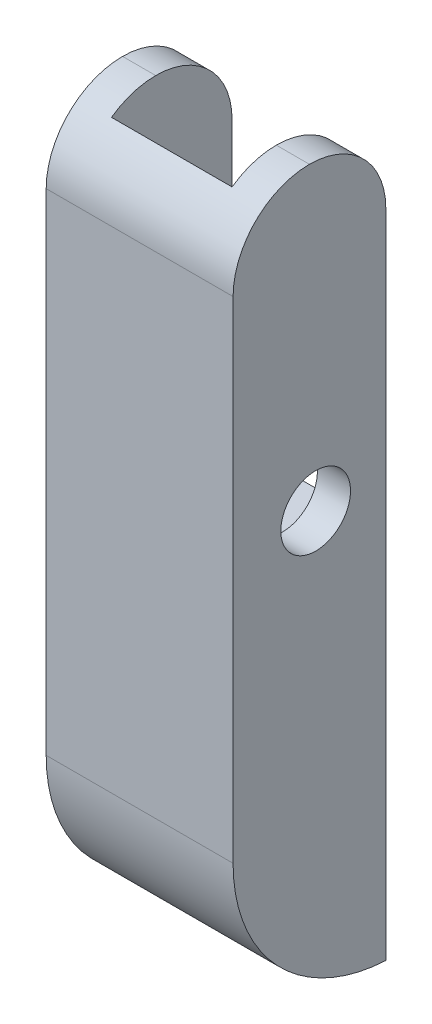
ISO-10303-21;
HEADER;
FILE_DESCRIPTION(('STEP AP214'),'2;1');
FILE_NAME('part.step','',(''),(''),'','','');
FILE_SCHEMA(('AUTOMOTIVE_DESIGN { 1 0 10303 214 1 1 1 1 }'));
ENDSEC;
DATA;
#1=APPLICATION_CONTEXT('core data for automotive mechanical design processes');
#2=APPLICATION_PROTOCOL_DEFINITION('international standard','automotive_design',2000,#1);
#3=PRODUCT_CONTEXT('',#1,'mechanical');
#4=PRODUCT('Part','Part','',(#3));
#5=PRODUCT_RELATED_PRODUCT_CATEGORY('part','',(#4));
#6=PRODUCT_DEFINITION_FORMATION('','',#4);
#7=PRODUCT_DEFINITION_CONTEXT('part definition',#1,'design');
#8=PRODUCT_DEFINITION('design','',#6,#7);
#9=PRODUCT_DEFINITION_SHAPE('','',#8);
#10=(LENGTH_UNIT() NAMED_UNIT(*) SI_UNIT(.MILLI.,.METRE.));
#11=(NAMED_UNIT(*) PLANE_ANGLE_UNIT() SI_UNIT($,.RADIAN.));
#12=(NAMED_UNIT(*) SI_UNIT($,.STERADIAN.) SOLID_ANGLE_UNIT());
#13=UNCERTAINTY_MEASURE_WITH_UNIT(LENGTH_MEASURE(1.E-05),#10,'distance_accuracy_value','');
#14=(GEOMETRIC_REPRESENTATION_CONTEXT(3) GLOBAL_UNCERTAINTY_ASSIGNED_CONTEXT((#13)) GLOBAL_UNIT_ASSIGNED_CONTEXT((#10,
#11,#12)) REPRESENTATION_CONTEXT('',''));
#15=CARTESIAN_POINT('',(0.,0.,0.));
#16=DIRECTION('',(0.,0.,1.));
#17=DIRECTION('',(1.,0.,0.));
#18=AXIS2_PLACEMENT_3D('',#15,#16,#17);
#19=CARTESIAN_POINT('',(0.,41.16324,4.826));
#20=DIRECTION('',(-1.,0.,0.));
#21=DIRECTION('',(0.,0.,1.));
#22=AXIS2_PLACEMENT_3D('',#19,#20,#21);
#23=CYLINDRICAL_SURFACE('',#22,4.826);
#24=CARTESIAN_POINT('',(9.7155,41.16324,4.826));
#25=DIRECTION('',(1.,0.,0.));
#26=DIRECTION('',(0.,1.,0.));
#27=AXIS2_PLACEMENT_3D('',#24,#25,#26);
#28=CIRCLE('',#27,4.826);
#29=CARTESIAN_POINT('',(9.7155,45.98924,4.826));
#30=VERTEX_POINT('',#29);
#31=CARTESIAN_POINT('',(9.7155,41.16324,0.));
#32=VERTEX_POINT('',#31);
#33=EDGE_CURVE('E179',#30,#32,#28,.F.);
#34=ORIENTED_EDGE('',*,*,#33,.F.);
#35=DIRECTION('',(1.,0.,0.));
#36=VECTOR('',#35,1.);
#37=CARTESIAN_POINT('',(0.,45.98924,4.826));
#38=LINE('',#37,#36);
#39=CARTESIAN_POINT('',(11.811,45.98924,4.826));
#40=VERTEX_POINT('',#39);
#41=EDGE_CURVE('E171',#40,#30,#38,.F.);
#42=ORIENTED_EDGE('',*,*,#41,.F.);
#43=CARTESIAN_POINT('',(11.811,41.16324,4.826));
#44=DIRECTION('',(-1.,0.,0.));
#45=DIRECTION('',(0.,0.,1.));
#46=AXIS2_PLACEMENT_3D('',#43,#44,#45);
#47=CIRCLE('',#46,4.826);
#48=CARTESIAN_POINT('',(11.811,41.16324,0.));
#49=VERTEX_POINT('',#48);
#50=EDGE_CURVE('E168',#49,#40,#47,.F.);
#51=ORIENTED_EDGE('',*,*,#50,.F.);
#52=DIRECTION('',(1.,0.,0.));
#53=VECTOR('',#52,1.);
#54=CARTESIAN_POINT('',(11.811,41.16324,0.));
#55=LINE('',#54,#53);
#56=EDGE_CURVE('E158',#32,#49,#55,.T.);
#57=ORIENTED_EDGE('',*,*,#56,.F.);
#58=EDGE_LOOP('',(#34,#42,#51,#57));
#59=FACE_BOUND('',#58,.T.);
#60=ADVANCED_FACE('F41',(#59),#23,.T.);
#61=CARTESIAN_POINT('',(11.811,0.,9.652));
#62=DIRECTION('',(-1.,0.,0.));
#63=DIRECTION('',(0.,0.,1.));
#64=AXIS2_PLACEMENT_3D('',#61,#62,#63);
#65=PLANE('',#64);
#66=CARTESIAN_POINT('',(11.811,26.82494,4.4323));
#67=DIRECTION('',(-1.,0.,0.));
#68=DIRECTION('',(0.,0.,1.));
#69=AXIS2_PLACEMENT_3D('',#66,#67,#68);
#70=CIRCLE('',#69,2.20345);
#71=CARTESIAN_POINT('',(11.811,26.82494,6.63575));
#72=VERTEX_POINT('',#71);
#73=EDGE_CURVE('E186',#72,#72,#70,.T.);
#74=ORIENTED_EDGE('',*,*,#73,.T.);
#75=EDGE_LOOP('',(#74));
#76=FACE_BOUND('',#75,.T.);
#77=DIRECTION('',(0.,1.,0.));
#78=VECTOR('',#77,1.);
#79=CARTESIAN_POINT('',(11.811,0.,9.652));
#80=LINE('',#79,#78);
#81=CARTESIAN_POINT('',(11.811,10.1472920525626,9.652));
#82=VERTEX_POINT('',#81);
#83=CARTESIAN_POINT('',(11.811,41.16324,9.652));
#84=VERTEX_POINT('',#83);
#85=EDGE_CURVE('E153',#82,#84,#80,.T.);
#86=ORIENTED_EDGE('',*,*,#85,.F.);
#87=CARTESIAN_POINT('',(11.811,10.1472920525626,-0.508000000000002));
#88=DIRECTION('',(-1.,0.,0.));
#89=DIRECTION('',(0.,0.,1.));
#90=AXIS2_PLACEMENT_3D('',#87,#88,#89);
#91=CIRCLE('',#90,10.16);
#92=CARTESIAN_POINT('',(11.811,0.,0.));
#93=VERTEX_POINT('',#92);
#94=EDGE_CURVE('E49',#82,#93,#91,.F.);
#95=ORIENTED_EDGE('',*,*,#94,.T.);
#96=DIRECTION('',(0.,1.,0.));
#97=VECTOR('',#96,1.);
#98=CARTESIAN_POINT('',(11.811,0.,0.));
#99=LINE('',#98,#97);
#100=EDGE_CURVE('E160',#93,#49,#99,.T.);
#101=ORIENTED_EDGE('',*,*,#100,.T.);
#102=ORIENTED_EDGE('',*,*,#50,.T.);
#103=CARTESIAN_POINT('',(11.811,41.16324,4.826));
#104=DIRECTION('',(-1.,0.,0.));
#105=DIRECTION('',(0.,0.,1.));
#106=AXIS2_PLACEMENT_3D('',#103,#104,#105);
#107=CIRCLE('',#106,4.826);
#108=EDGE_CURVE('E191',#40,#84,#107,.F.);
#109=ORIENTED_EDGE('',*,*,#108,.T.);
#110=EDGE_LOOP('',(#86,#95,#101,#102,#109));
#111=FACE_BOUND('',#110,.T.);
#112=ADVANCED_FACE('F203',(#76,#111),#65,.F.);
#113=CARTESIAN_POINT('',(0.,0.,9.652));
#114=DIRECTION('',(-1.,0.,0.));
#115=DIRECTION('',(0.,0.,1.));
#116=AXIS2_PLACEMENT_3D('',#113,#114,#115);
#117=PLANE('',#116);
#118=CARTESIAN_POINT('',(0.,26.82494,4.4323));
#119=DIRECTION('',(-1.,0.,0.));
#120=DIRECTION('',(0.,0.,1.));
#121=AXIS2_PLACEMENT_3D('',#118,#119,#120);
#122=CIRCLE('',#121,2.20345);
#123=CARTESIAN_POINT('',(0.,26.82494,6.63575));
#124=VERTEX_POINT('',#123);
#125=EDGE_CURVE('E148',#124,#124,#122,.T.);
#126=ORIENTED_EDGE('',*,*,#125,.F.);
#127=EDGE_LOOP('',(#126));
#128=FACE_BOUND('',#127,.T.);
#129=DIRECTION('',(0.,1.,0.));
#130=VECTOR('',#129,1.);
#131=CARTESIAN_POINT('',(0.,0.,0.));
#132=LINE('',#131,#130);
#133=CARTESIAN_POINT('',(0.,0.,0.));
#134=VERTEX_POINT('',#133);
#135=CARTESIAN_POINT('',(0.,41.16324,0.));
#136=VERTEX_POINT('',#135);
#137=EDGE_CURVE('E156',#134,#136,#132,.T.);
#138=ORIENTED_EDGE('',*,*,#137,.F.);
#139=CARTESIAN_POINT('',(0.,10.1472920525626,-0.508000000000002));
#140=DIRECTION('',(-1.,0.,0.));
#141=DIRECTION('',(0.,0.,1.));
#142=AXIS2_PLACEMENT_3D('',#139,#140,#141);
#143=CIRCLE('',#142,10.16);
#144=CARTESIAN_POINT('',(0.,10.1472920525626,9.652));
#145=VERTEX_POINT('',#144);
#146=EDGE_CURVE('E12',#134,#145,#143,.T.);
#147=ORIENTED_EDGE('',*,*,#146,.T.);
#148=DIRECTION('',(0.,1.,0.));
#149=VECTOR('',#148,1.);
#150=CARTESIAN_POINT('',(0.,0.,9.652));
#151=LINE('',#150,#149);
#152=CARTESIAN_POINT('',(0.,41.16324,9.652));
#153=VERTEX_POINT('',#152);
#154=EDGE_CURVE('E155',#145,#153,#151,.T.);
#155=ORIENTED_EDGE('',*,*,#154,.T.);
#156=CARTESIAN_POINT('',(0.,41.16324,4.826));
#157=DIRECTION('',(-1.,0.,0.));
#158=DIRECTION('',(0.,0.,1.));
#159=AXIS2_PLACEMENT_3D('',#156,#157,#158);
#160=CIRCLE('',#159,4.826);
#161=CARTESIAN_POINT('',(0.,45.98924,4.826));
#162=VERTEX_POINT('',#161);
#163=EDGE_CURVE('E197',#153,#162,#160,.T.);
#164=ORIENTED_EDGE('',*,*,#163,.T.);
#165=CARTESIAN_POINT('',(0.,41.16324,4.826));
#166=DIRECTION('',(-1.,0.,0.));
#167=DIRECTION('',(0.,0.,1.));
#168=AXIS2_PLACEMENT_3D('',#165,#166,#167);
#169=CIRCLE('',#168,4.826);
#170=EDGE_CURVE('E174',#162,#136,#169,.T.);
#171=ORIENTED_EDGE('',*,*,#170,.T.);
#172=EDGE_LOOP('',(#138,#147,#155,#164,#171));
#173=FACE_BOUND('',#172,.T.);
#174=ADVANCED_FACE('F212',(#128,#173),#117,.T.);
#175=CARTESIAN_POINT('',(0.,0.,9.652));
#176=DIRECTION('',(0.,0.,1.));
#177=DIRECTION('',(1.,0.,0.));
#178=AXIS2_PLACEMENT_3D('',#175,#176,#177);
#179=PLANE('',#178);
#180=ORIENTED_EDGE('',*,*,#154,.F.);
#181=DIRECTION('',(-1.,0.,0.));
#182=VECTOR('',#181,1.);
#183=CARTESIAN_POINT('',(11.811,10.1472920525626,9.652));
#184=LINE('',#183,#182);
#185=EDGE_CURVE('E199',#145,#82,#184,.F.);
#186=ORIENTED_EDGE('',*,*,#185,.T.);
#187=ORIENTED_EDGE('',*,*,#85,.T.);
#188=DIRECTION('',(1.,0.,0.));
#189=VECTOR('',#188,1.);
#190=CARTESIAN_POINT('',(0.,41.16324,9.652));
#191=LINE('',#190,#189);
#192=EDGE_CURVE('E194',#84,#153,#191,.F.);
#193=ORIENTED_EDGE('',*,*,#192,.T.);
#194=EDGE_LOOP('',(#180,#186,#187,#193));
#195=FACE_BOUND('',#194,.T.);
#196=ADVANCED_FACE('F209',(#195),#179,.T.);
#197=CARTESIAN_POINT('',(0.,0.,0.));
#198=DIRECTION('',(0.,0.,1.));
#199=DIRECTION('',(1.,0.,0.));
#200=AXIS2_PLACEMENT_3D('',#197,#198,#199);
#201=PLANE('',#200);
#202=DIRECTION('',(-1.,0.,0.));
#203=VECTOR('',#202,1.);
#204=CARTESIAN_POINT('',(9.7155,23.63724,0.));
#205=LINE('',#204,#203);
#206=CARTESIAN_POINT('',(9.7155,23.63724,0.));
#207=VERTEX_POINT('',#206);
#208=CARTESIAN_POINT('',(2.0955,23.63724,0.));
#209=VERTEX_POINT('',#208);
#210=EDGE_CURVE('E147',#207,#209,#205,.T.);
#211=ORIENTED_EDGE('',*,*,#210,.F.);
#212=DIRECTION('',(0.,-1.,0.));
#213=VECTOR('',#212,1.);
#214=CARTESIAN_POINT('',(9.7155,45.98924,0.));
#215=LINE('',#214,#213);
#216=EDGE_CURVE('E133',#32,#207,#215,.T.);
#217=ORIENTED_EDGE('',*,*,#216,.F.);
#218=ORIENTED_EDGE('',*,*,#56,.T.);
#219=ORIENTED_EDGE('',*,*,#100,.F.);
#220=DIRECTION('',(1.,0.,0.));
#221=VECTOR('',#220,1.);
#222=CARTESIAN_POINT('',(0.,0.,0.));
#223=LINE('',#222,#221);
#224=EDGE_CURVE('E151',#134,#93,#223,.T.);
#225=ORIENTED_EDGE('',*,*,#224,.F.);
#226=ORIENTED_EDGE('',*,*,#137,.T.);
#227=CARTESIAN_POINT('',(2.0955,41.16324,0.));
#228=VERTEX_POINT('',#227);
#229=EDGE_CURVE('E165',#136,#228,#55,.T.);
#230=ORIENTED_EDGE('',*,*,#229,.T.);
#231=DIRECTION('',(0.,1.,0.));
#232=VECTOR('',#231,1.);
#233=CARTESIAN_POINT('',(2.0955,45.98924,0.));
#234=LINE('',#233,#232);
#235=EDGE_CURVE('E127',#209,#228,#234,.T.);
#236=ORIENTED_EDGE('',*,*,#235,.F.);
#237=EDGE_LOOP('',(#211,#217,#218,#219,#225,#226,#230,#236));
#238=FACE_BOUND('',#237,.T.);
#239=ADVANCED_FACE('F205',(#238),#201,.F.);
#240=CARTESIAN_POINT('',(2.0955,41.16324,4.826));
#241=DIRECTION('',(-1.,0.,0.));
#242=DIRECTION('',(0.,-1.,0.));
#243=AXIS2_PLACEMENT_3D('',#240,#241,#242);
#244=CIRCLE('',#243,4.826);
#245=CARTESIAN_POINT('',(2.0955,45.98924,4.826));
#246=VERTEX_POINT('',#245);
#247=EDGE_CURVE('E176',#228,#246,#244,.F.);
#248=ORIENTED_EDGE('',*,*,#247,.F.);
#249=ORIENTED_EDGE('',*,*,#229,.F.);
#250=ORIENTED_EDGE('',*,*,#170,.F.);
#251=EDGE_CURVE('E170',#246,#162,#38,.F.);
#252=ORIENTED_EDGE('',*,*,#251,.F.);
#253=EDGE_LOOP('',(#248,#249,#250,#252));
#254=FACE_BOUND('',#253,.T.);
#255=ADVANCED_FACE('F220',(#254),#23,.T.);
#256=CARTESIAN_POINT('',(9.7155,45.98924,7.62));
#257=DIRECTION('',(1.,0.,0.));
#258=DIRECTION('',(0.,1.,0.));
#259=AXIS2_PLACEMENT_3D('',#256,#257,#258);
#260=PLANE('',#259);
#261=CARTESIAN_POINT('',(9.7155,26.82494,4.4323));
#262=DIRECTION('',(1.,0.,0.));
#263=DIRECTION('',(0.,1.,0.));
#264=AXIS2_PLACEMENT_3D('',#261,#262,#263);
#265=CIRCLE('',#264,2.20345);
#266=CARTESIAN_POINT('',(9.7155,29.02839,4.4323));
#267=VERTEX_POINT('',#266);
#268=EDGE_CURVE('E185',#267,#267,#265,.T.);
#269=ORIENTED_EDGE('',*,*,#268,.T.);
#270=EDGE_LOOP('',(#269));
#271=FACE_BOUND('',#270,.T.);
#272=DIRECTION('',(0.,-1.,0.));
#273=VECTOR('',#272,1.);
#274=CARTESIAN_POINT('',(9.7155,45.98924,7.62));
#275=LINE('',#274,#273);
#276=CARTESIAN_POINT('',(9.7155,45.0981910797467,7.62));
#277=VERTEX_POINT('',#276);
#278=CARTESIAN_POINT('',(9.7155,23.63724,7.62));
#279=VERTEX_POINT('',#278);
#280=EDGE_CURVE('E117',#277,#279,#275,.T.);
#281=ORIENTED_EDGE('',*,*,#280,.F.);
#282=CARTESIAN_POINT('',(9.7155,41.16324,4.826));
#283=DIRECTION('',(1.,0.,0.));
#284=DIRECTION('',(0.,1.,0.));
#285=AXIS2_PLACEMENT_3D('',#282,#283,#284);
#286=CIRCLE('',#285,4.826);
#287=EDGE_CURVE('E189',#277,#30,#286,.F.);
#288=ORIENTED_EDGE('',*,*,#287,.T.);
#289=ORIENTED_EDGE('',*,*,#33,.T.);
#290=ORIENTED_EDGE('',*,*,#216,.T.);
#291=DIRECTION('',(0.,0.,-1.));
#292=VECTOR('',#291,1.);
#293=CARTESIAN_POINT('',(9.7155,23.63724,7.62));
#294=LINE('',#293,#292);
#295=EDGE_CURVE('E130',#279,#207,#294,.T.);
#296=ORIENTED_EDGE('',*,*,#295,.F.);
#297=EDGE_LOOP('',(#281,#288,#289,#290,#296));
#298=FACE_BOUND('',#297,.T.);
#299=ADVANCED_FACE('F131',(#271,#298),#260,.F.);
#300=CARTESIAN_POINT('',(2.0955,45.98924,7.62));
#301=DIRECTION('',(-1.,0.,0.));
#302=DIRECTION('',(0.,-1.,0.));
#303=AXIS2_PLACEMENT_3D('',#300,#301,#302);
#304=PLANE('',#303);
#305=CARTESIAN_POINT('',(2.0955,26.82494,4.4323));
#306=DIRECTION('',(-1.,0.,0.));
#307=DIRECTION('',(0.,-1.,0.));
#308=AXIS2_PLACEMENT_3D('',#305,#306,#307);
#309=CIRCLE('',#308,2.20345);
#310=CARTESIAN_POINT('',(2.0955,24.62149,4.4323));
#311=VERTEX_POINT('',#310);
#312=EDGE_CURVE('E182',#311,#311,#309,.T.);
#313=ORIENTED_EDGE('',*,*,#312,.T.);
#314=EDGE_LOOP('',(#313));
#315=FACE_BOUND('',#314,.T.);
#316=ORIENTED_EDGE('',*,*,#247,.T.);
#317=CARTESIAN_POINT('',(2.0955,41.16324,4.826));
#318=DIRECTION('',(-1.,0.,0.));
#319=DIRECTION('',(0.,-1.,0.));
#320=AXIS2_PLACEMENT_3D('',#317,#318,#319);
#321=CIRCLE('',#320,4.826);
#322=CARTESIAN_POINT('',(2.0955,45.0981910797467,7.62));
#323=VERTEX_POINT('',#322);
#324=EDGE_CURVE('E181',#246,#323,#321,.F.);
#325=ORIENTED_EDGE('',*,*,#324,.T.);
#326=DIRECTION('',(0.,1.,0.));
#327=VECTOR('',#326,1.);
#328=CARTESIAN_POINT('',(2.0955,45.98924,7.62));
#329=LINE('',#328,#327);
#330=CARTESIAN_POINT('',(2.0955,23.63724,7.62));
#331=VERTEX_POINT('',#330);
#332=EDGE_CURVE('E138',#331,#323,#329,.T.);
#333=ORIENTED_EDGE('',*,*,#332,.F.);
#334=DIRECTION('',(0.,0.,-1.));
#335=VECTOR('',#334,1.);
#336=CARTESIAN_POINT('',(2.0955,23.63724,7.62));
#337=LINE('',#336,#335);
#338=EDGE_CURVE('E137',#331,#209,#337,.T.);
#339=ORIENTED_EDGE('',*,*,#338,.T.);
#340=ORIENTED_EDGE('',*,*,#235,.T.);
#341=EDGE_LOOP('',(#316,#325,#333,#339,#340));
#342=FACE_BOUND('',#341,.T.);
#343=ADVANCED_FACE('F223',(#315,#342),#304,.F.);
#344=CARTESIAN_POINT('',(9.7155,23.63724,7.62));
#345=DIRECTION('',(0.,-1.,0.));
#346=DIRECTION('',(0.,0.,-1.));
#347=AXIS2_PLACEMENT_3D('',#344,#345,#346);
#348=PLANE('',#347);
#349=ORIENTED_EDGE('',*,*,#210,.T.);
#350=ORIENTED_EDGE('',*,*,#338,.F.);
#351=DIRECTION('',(-1.,0.,0.));
#352=VECTOR('',#351,1.);
#353=CARTESIAN_POINT('',(9.7155,23.63724,7.62));
#354=LINE('',#353,#352);
#355=EDGE_CURVE('E122',#279,#331,#354,.T.);
#356=ORIENTED_EDGE('',*,*,#355,.F.);
#357=ORIENTED_EDGE('',*,*,#295,.T.);
#358=EDGE_LOOP('',(#349,#350,#356,#357));
#359=FACE_BOUND('',#358,.T.);
#360=ADVANCED_FACE('F140',(#359),#348,.F.);
#361=CARTESIAN_POINT('',(0.,0.,7.62));
#362=DIRECTION('',(0.,0.,-1.));
#363=DIRECTION('',(-1.,0.,0.));
#364=AXIS2_PLACEMENT_3D('',#361,#362,#363);
#365=PLANE('',#364);
#366=ORIENTED_EDGE('',*,*,#332,.T.);
#367=DIRECTION('',(1.,0.,0.));
#368=VECTOR('',#367,1.);
#369=CARTESIAN_POINT('',(2.0955,45.0981910797467,7.62));
#370=LINE('',#369,#368);
#371=EDGE_CURVE('E124',#323,#277,#370,.T.);
#372=ORIENTED_EDGE('',*,*,#371,.T.);
#373=ORIENTED_EDGE('',*,*,#280,.T.);
#374=ORIENTED_EDGE('',*,*,#355,.T.);
#375=EDGE_LOOP('',(#366,#372,#373,#374));
#376=FACE_BOUND('',#375,.T.);
#377=ADVANCED_FACE('F120',(#376),#365,.T.);
#378=CARTESIAN_POINT('',(11.811,26.82494,4.4323));
#379=DIRECTION('',(-1.,0.,0.));
#380=DIRECTION('',(0.,0.,1.));
#381=AXIS2_PLACEMENT_3D('',#378,#379,#380);
#382=CYLINDRICAL_SURFACE('',#381,2.20345);
#383=ORIENTED_EDGE('',*,*,#125,.T.);
#384=EDGE_LOOP('',(#383));
#385=FACE_BOUND('',#384,.T.);
#386=ORIENTED_EDGE('',*,*,#312,.F.);
#387=EDGE_LOOP('',(#386));
#388=FACE_BOUND('',#387,.T.);
#389=ADVANCED_FACE('F265',(#385,#388),#382,.F.);
#390=ORIENTED_EDGE('',*,*,#73,.F.);
#391=EDGE_LOOP('',(#390));
#392=FACE_BOUND('',#391,.T.);
#393=ORIENTED_EDGE('',*,*,#268,.F.);
#394=EDGE_LOOP('',(#393));
#395=FACE_BOUND('',#394,.T.);
#396=ADVANCED_FACE('F262',(#392,#395),#382,.F.);
#397=CARTESIAN_POINT('',(0.,41.16324,4.826));
#398=DIRECTION('',(1.,0.,0.));
#399=DIRECTION('',(0.,0.,-1.));
#400=AXIS2_PLACEMENT_3D('',#397,#398,#399);
#401=CYLINDRICAL_SURFACE('',#400,4.826);
#402=ORIENTED_EDGE('',*,*,#163,.F.);
#403=ORIENTED_EDGE('',*,*,#192,.F.);
#404=ORIENTED_EDGE('',*,*,#108,.F.);
#405=ORIENTED_EDGE('',*,*,#41,.T.);
#406=ORIENTED_EDGE('',*,*,#287,.F.);
#407=ORIENTED_EDGE('',*,*,#371,.F.);
#408=ORIENTED_EDGE('',*,*,#324,.F.);
#409=ORIENTED_EDGE('',*,*,#251,.T.);
#410=EDGE_LOOP('',(#402,#403,#404,#405,#406,#407,#408,#409));
#411=FACE_BOUND('',#410,.T.);
#412=ADVANCED_FACE('F221',(#411),#401,.T.);
#413=CARTESIAN_POINT('',(0.,10.1472920525626,-0.508000000000002));
#414=DIRECTION('',(1.,0.,0.));
#415=DIRECTION('',(0.,0.,-1.));
#416=AXIS2_PLACEMENT_3D('',#413,#414,#415);
#417=CYLINDRICAL_SURFACE('',#416,10.16);
#418=ORIENTED_EDGE('',*,*,#146,.F.);
#419=ORIENTED_EDGE('',*,*,#224,.T.);
#420=ORIENTED_EDGE('',*,*,#94,.F.);
#421=ORIENTED_EDGE('',*,*,#185,.F.);
#422=EDGE_LOOP('',(#418,#419,#420,#421));
#423=FACE_BOUND('',#422,.T.);
#424=ADVANCED_FACE('F43',(#423),#417,.T.);
#425=CLOSED_SHELL('',(#60,#112,#174,#196,#239,#255,#299,#343,#360,#377,#389,#396,#412,#424));
#426=MANIFOLD_SOLID_BREP('B2',#425);
#427=ADVANCED_BREP_SHAPE_REPRESENTATION('',(#18,#426),#14);
#428=SHAPE_DEFINITION_REPRESENTATION(#9,#427);
ENDSEC;
END-ISO-10303-21;
